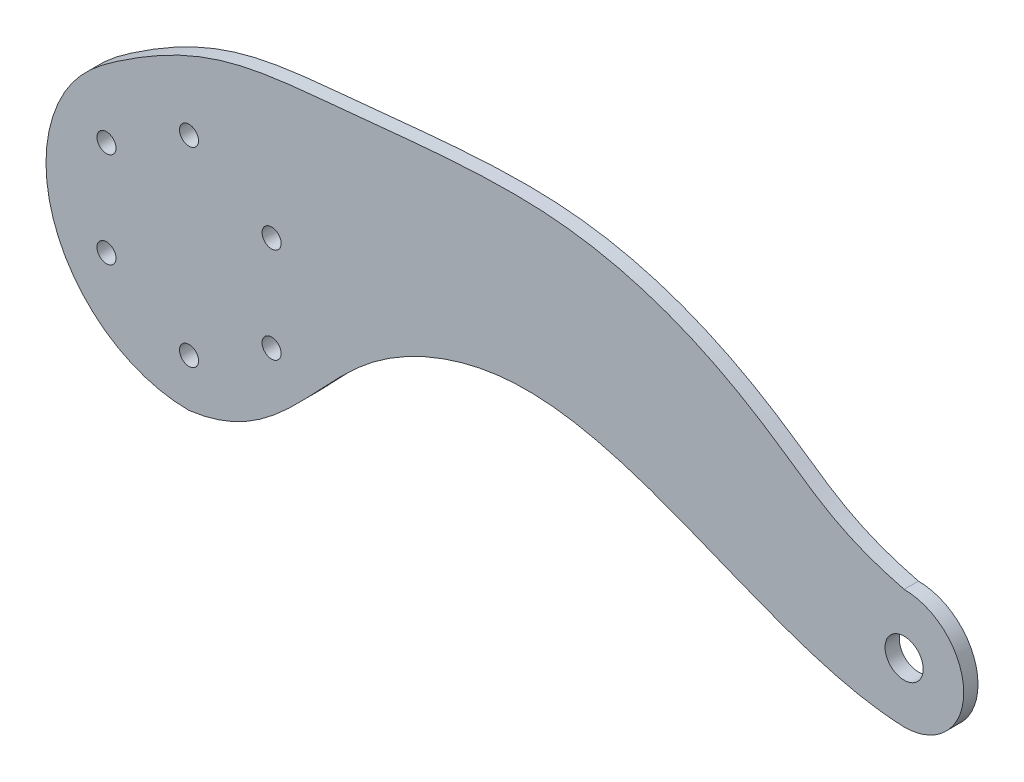
ISO-10303-21;
HEADER;
FILE_DESCRIPTION(('STEP AP214'),'2;1');
FILE_NAME('part.step','',(''),(''),'','','');
FILE_SCHEMA(('AUTOMOTIVE_DESIGN { 1 0 10303 214 1 1 1 1 }'));
ENDSEC;
DATA;
#1=APPLICATION_CONTEXT('core data for automotive mechanical design processes');
#2=APPLICATION_PROTOCOL_DEFINITION('international standard','automotive_design',2000,#1);
#3=PRODUCT_CONTEXT('',#1,'mechanical');
#4=PRODUCT('Part','Part','',(#3));
#5=PRODUCT_RELATED_PRODUCT_CATEGORY('part','',(#4));
#6=PRODUCT_DEFINITION_FORMATION('','',#4);
#7=PRODUCT_DEFINITION_CONTEXT('part definition',#1,'design');
#8=PRODUCT_DEFINITION('design','',#6,#7);
#9=PRODUCT_DEFINITION_SHAPE('','',#8);
#10=(LENGTH_UNIT() NAMED_UNIT(*) SI_UNIT(.MILLI.,.METRE.));
#11=(NAMED_UNIT(*) PLANE_ANGLE_UNIT() SI_UNIT($,.RADIAN.));
#12=(NAMED_UNIT(*) SI_UNIT($,.STERADIAN.) SOLID_ANGLE_UNIT());
#13=UNCERTAINTY_MEASURE_WITH_UNIT(LENGTH_MEASURE(1.E-05),#10,'distance_accuracy_value','');
#14=(GEOMETRIC_REPRESENTATION_CONTEXT(3) GLOBAL_UNCERTAINTY_ASSIGNED_CONTEXT((#13)) GLOBAL_UNIT_ASSIGNED_CONTEXT((#10,
#11,#12)) REPRESENTATION_CONTEXT('',''));
#15=CARTESIAN_POINT('',(0.,0.,0.));
#16=DIRECTION('',(0.,0.,1.));
#17=DIRECTION('',(1.,0.,0.));
#18=AXIS2_PLACEMENT_3D('',#15,#16,#17);
#19=CARTESIAN_POINT('',(150.,0.,3.));
#20=DIRECTION('',(0.,0.,-1.));
#21=DIRECTION('',(-1.,0.,0.));
#22=AXIS2_PLACEMENT_3D('',#19,#20,#21);
#23=CYLINDRICAL_SURFACE('',#22,12.5);
#24=CARTESIAN_POINT('',(150.,0.,0.));
#25=DIRECTION('',(0.,0.,1.));
#26=DIRECTION('',(1.,0.,0.));
#27=AXIS2_PLACEMENT_3D('',#24,#25,#26);
#28=CIRCLE('',#27,12.5);
#29=CARTESIAN_POINT('',(159.428456141883,-8.2069613609783,0.));
#30=VERTEX_POINT('',#29);
#31=CARTESIAN_POINT('',(150.,12.5,0.));
#32=VERTEX_POINT('',#31);
#33=EDGE_CURVE('E174',#30,#32,#28,.T.);
#34=ORIENTED_EDGE('',*,*,#33,.T.);
#35=DIRECTION('',(0.,0.,-1.));
#36=VECTOR('',#35,1.);
#37=CARTESIAN_POINT('',(150.,12.5,3.));
#38=LINE('',#37,#36);
#39=CARTESIAN_POINT('',(150.,12.5,3.));
#40=VERTEX_POINT('',#39);
#41=EDGE_CURVE('E11',#40,#32,#38,.T.);
#42=ORIENTED_EDGE('',*,*,#41,.F.);
#43=CARTESIAN_POINT('',(150.,0.,3.));
#44=DIRECTION('',(0.,0.,1.));
#45=DIRECTION('',(1.,0.,0.));
#46=AXIS2_PLACEMENT_3D('',#43,#44,#45);
#47=CIRCLE('',#46,12.5);
#48=CARTESIAN_POINT('',(159.428456141883,-8.2069613609783,3.));
#49=VERTEX_POINT('',#48);
#50=EDGE_CURVE('E91',#49,#40,#47,.T.);
#51=ORIENTED_EDGE('',*,*,#50,.F.);
#52=DIRECTION('',(0.,0.,-1.));
#53=VECTOR('',#52,1.);
#54=CARTESIAN_POINT('',(159.428456141883,-8.2069613609783,3.));
#55=LINE('',#54,#53);
#56=EDGE_CURVE('E155',#49,#30,#55,.T.);
#57=ORIENTED_EDGE('',*,*,#56,.T.);
#58=EDGE_LOOP('',(#34,#42,#51,#57));
#59=FACE_BOUND('',#58,.T.);
#60=ADVANCED_FACE('F40',(#59),#23,.T.);
#61=CARTESIAN_POINT('',(-26.0634616612886,14.8558394656963,3.));
#62=CARTESIAN_POINT('',(-22.9952074946197,20.2388624193786,3.));
#63=CARTESIAN_POINT('',(2.37328640151583,39.108047074936,3.));
#64=CARTESIAN_POINT('',(20.1597515349127,39.1077374338959,3.));
#65=CARTESIAN_POINT('',(86.7416157626449,46.9998153067509,3.));
#66=CARTESIAN_POINT('',(125.812924925436,25.830072721874,3.));
#67=CARTESIAN_POINT('',(135.882657692138,16.0754827587227,3.));
#68=CARTESIAN_POINT('',(150.,12.5,3.));
#69=B_SPLINE_CURVE_WITH_KNOTS('',3,(#61,#62,#63,#64,#65,#66,#67,#68),.UNSPECIFIED.,.F.,.F.,(4,1,
1,1,1,4),(0.,0.056043778506057,0.324796612619319,0.474987683898155,0.725167046493458,
0.945335070860267),.UNSPECIFIED.);
#70=DIRECTION('',(0.,0.,-1.));
#71=VECTOR('',#70,1.);
#72=SURFACE_OF_LINEAR_EXTRUSION('',#69,#71);
#73=CARTESIAN_POINT('',(-26.0634616612886,14.8558394656963,0.));
#74=CARTESIAN_POINT('',(-22.9952074946197,20.2388624193786,0.));
#75=CARTESIAN_POINT('',(2.37328640151583,39.108047074936,0.));
#76=CARTESIAN_POINT('',(20.1597515349127,39.1077374338959,0.));
#77=CARTESIAN_POINT('',(86.7416157626449,46.9998153067509,0.));
#78=CARTESIAN_POINT('',(125.812924925436,25.830072721874,0.));
#79=CARTESIAN_POINT('',(135.882657692138,16.0754827587227,0.));
#80=CARTESIAN_POINT('',(150.,12.5,0.));
#81=B_SPLINE_CURVE_WITH_KNOTS('',3,(#73,#74,#75,#76,#77,#78,#79,#80),.UNSPECIFIED.,.F.,.F.,(4,1,
1,1,1,4),(0.,0.056043778506057,0.324796612619319,0.474987683898155,0.725167046493458,
0.945335070860267),.UNSPECIFIED.);
#82=CARTESIAN_POINT('',(-26.0634616612886,14.8558394656963,0.));
#83=VERTEX_POINT('',#82);
#84=EDGE_CURVE('E170',#83,#32,#81,.T.);
#85=ORIENTED_EDGE('',*,*,#84,.F.);
#86=DIRECTION('',(0.,0.,-1.));
#87=VECTOR('',#86,1.);
#88=CARTESIAN_POINT('',(-26.0634616612886,14.8558394656963,3.));
#89=LINE('',#88,#87);
#90=CARTESIAN_POINT('',(-26.0634616612886,14.8558394656963,3.));
#91=VERTEX_POINT('',#90);
#92=EDGE_CURVE('E49',#91,#83,#89,.T.);
#93=ORIENTED_EDGE('',*,*,#92,.F.);
#94=EDGE_CURVE('E125',#91,#40,#69,.T.);
#95=ORIENTED_EDGE('',*,*,#94,.T.);
#96=ORIENTED_EDGE('',*,*,#41,.T.);
#97=EDGE_LOOP('',(#85,#93,#95,#96));
#98=FACE_BOUND('',#97,.T.);
#99=ADVANCED_FACE('F172',(#98),#72,.T.);
#100=CARTESIAN_POINT('',(0.,0.,3.));
#101=DIRECTION('',(0.,0.,-1.));
#102=DIRECTION('',(-1.,0.,0.));
#103=AXIS2_PLACEMENT_3D('',#100,#101,#102);
#104=CYLINDRICAL_SURFACE('',#103,30.);
#105=CARTESIAN_POINT('',(0.,0.,0.));
#106=DIRECTION('',(0.,0.,1.));
#107=DIRECTION('',(1.,0.,0.));
#108=AXIS2_PLACEMENT_3D('',#105,#106,#107);
#109=CIRCLE('',#108,30.);
#110=CARTESIAN_POINT('',(0.,-30.,0.));
#111=VERTEX_POINT('',#110);
#112=EDGE_CURVE('E162',#83,#111,#109,.T.);
#113=ORIENTED_EDGE('',*,*,#112,.T.);
#114=DIRECTION('',(0.,0.,-1.));
#115=VECTOR('',#114,1.);
#116=CARTESIAN_POINT('',(0.,-30.,3.));
#117=LINE('',#116,#115);
#118=CARTESIAN_POINT('',(0.,-30.,3.));
#119=VERTEX_POINT('',#118);
#120=EDGE_CURVE('E116',#119,#111,#117,.T.);
#121=ORIENTED_EDGE('',*,*,#120,.F.);
#122=CARTESIAN_POINT('',(0.,0.,3.));
#123=DIRECTION('',(0.,0.,1.));
#124=DIRECTION('',(1.,0.,0.));
#125=AXIS2_PLACEMENT_3D('',#122,#123,#124);
#126=CIRCLE('',#125,30.);
#127=EDGE_CURVE('E107',#91,#119,#126,.T.);
#128=ORIENTED_EDGE('',*,*,#127,.F.);
#129=ORIENTED_EDGE('',*,*,#92,.T.);
#130=EDGE_LOOP('',(#113,#121,#128,#129));
#131=FACE_BOUND('',#130,.T.);
#132=ADVANCED_FACE('F161',(#131),#104,.T.);
#133=CARTESIAN_POINT('',(0.,-30.,3.));
#134=CARTESIAN_POINT('',(17.9367533899456,-27.7458951634713,3.));
#135=CARTESIAN_POINT('',(30.1701670762407,-2.35203179127826,3.));
#136=CARTESIAN_POINT('',(85.2158700652859,19.6119948147056,3.));
#137=CARTESIAN_POINT('',(122.199362380188,-11.5342342503251,3.));
#138=CARTESIAN_POINT('',(150.,-12.5,3.));
#139=B_SPLINE_CURVE_WITH_KNOTS('',3,(#133,#134,#135,#136,#137,#138),.UNSPECIFIED.,.F.,.F.,(4,1,
1,4),(0.,0.288188907900472,0.475939829148129,1.),.UNSPECIFIED.);
#140=DIRECTION('',(0.,0.,-1.));
#141=VECTOR('',#140,1.);
#142=SURFACE_OF_LINEAR_EXTRUSION('',#139,#141);
#143=CARTESIAN_POINT('',(0.,-30.,0.));
#144=CARTESIAN_POINT('',(17.9367533899456,-27.7458951634713,0.));
#145=CARTESIAN_POINT('',(30.1701670762407,-2.35203179127826,0.));
#146=CARTESIAN_POINT('',(85.2158700652859,19.6119948147056,0.));
#147=CARTESIAN_POINT('',(122.199362380188,-11.5342342503251,0.));
#148=CARTESIAN_POINT('',(150.,-12.5,0.));
#149=B_SPLINE_CURVE_WITH_KNOTS('',3,(#143,#144,#145,#146,#147,#148),.UNSPECIFIED.,.F.,.F.,(4,1,
1,4),(0.,0.288188907900472,0.475939829148129,1.),.UNSPECIFIED.);
#150=CARTESIAN_POINT('',(150.,-12.5,0.));
#151=VERTEX_POINT('',#150);
#152=EDGE_CURVE('E115',#111,#151,#149,.T.);
#153=ORIENTED_EDGE('',*,*,#152,.T.);
#154=DIRECTION('',(0.,0.,-1.));
#155=VECTOR('',#154,1.);
#156=CARTESIAN_POINT('',(150.,-12.5,3.));
#157=LINE('',#156,#155);
#158=CARTESIAN_POINT('',(150.,-12.5,3.));
#159=VERTEX_POINT('',#158);
#160=EDGE_CURVE('E112',#159,#151,#157,.T.);
#161=ORIENTED_EDGE('',*,*,#160,.F.);
#162=EDGE_CURVE('E100',#119,#159,#139,.T.);
#163=ORIENTED_EDGE('',*,*,#162,.F.);
#164=ORIENTED_EDGE('',*,*,#120,.T.);
#165=EDGE_LOOP('',(#153,#161,#163,#164));
#166=FACE_BOUND('',#165,.T.);
#167=ADVANCED_FACE('F113',(#166),#142,.F.);
#168=CARTESIAN_POINT('',(157.604608426971,-9.92068196609678,0.));
#169=VERTEX_POINT('',#168);
#170=EDGE_CURVE('E79',#151,#169,#28,.T.);
#171=ORIENTED_EDGE('',*,*,#170,.T.);
#172=DIRECTION('',(0.,0.,-1.));
#173=VECTOR('',#172,1.);
#174=CARTESIAN_POINT('',(157.604608426971,-9.92068196609678,3.));
#175=LINE('',#174,#173);
#176=CARTESIAN_POINT('',(157.604608426971,-9.92068196609678,3.));
#177=VERTEX_POINT('',#176);
#178=EDGE_CURVE('E117',#177,#169,#175,.T.);
#179=ORIENTED_EDGE('',*,*,#178,.F.);
#180=EDGE_CURVE('E105',#159,#177,#47,.T.);
#181=ORIENTED_EDGE('',*,*,#180,.F.);
#182=ORIENTED_EDGE('',*,*,#160,.T.);
#183=EDGE_LOOP('',(#171,#179,#181,#182));
#184=FACE_BOUND('',#183,.T.);
#185=ADVANCED_FACE('F119',(#184),#23,.T.);
#186=CARTESIAN_POINT('',(-17.3205080756875,-10.0000000000007,3.));
#187=DIRECTION('',(0.,0.,-1.));
#188=DIRECTION('',(-1.,0.,0.));
#189=AXIS2_PLACEMENT_3D('',#186,#187,#188);
#190=CYLINDRICAL_SURFACE('',#189,2.);
#191=CARTESIAN_POINT('',(-17.3205080756875,-10.0000000000007,3.));
#192=DIRECTION('',(0.,0.,1.));
#193=DIRECTION('',(1.,0.,0.));
#194=AXIS2_PLACEMENT_3D('',#191,#192,#193);
#195=CIRCLE('',#194,2.);
#196=CARTESIAN_POINT('',(-15.3205080756875,-10.0000000000007,3.));
#197=VERTEX_POINT('',#196);
#198=EDGE_CURVE('E121',#197,#197,#195,.T.);
#199=ORIENTED_EDGE('',*,*,#198,.T.);
#200=EDGE_LOOP('',(#199));
#201=FACE_BOUND('',#200,.T.);
#202=CARTESIAN_POINT('',(-17.3205080756875,-10.0000000000007,0.));
#203=DIRECTION('',(0.,0.,1.));
#204=DIRECTION('',(1.,0.,0.));
#205=AXIS2_PLACEMENT_3D('',#202,#203,#204);
#206=CIRCLE('',#205,2.);
#207=CARTESIAN_POINT('',(-15.3205080756875,-10.0000000000007,0.));
#208=VERTEX_POINT('',#207);
#209=EDGE_CURVE('E147',#208,#208,#206,.T.);
#210=ORIENTED_EDGE('',*,*,#209,.F.);
#211=EDGE_LOOP('',(#210));
#212=FACE_BOUND('',#211,.T.);
#213=ADVANCED_FACE('F228',(#201,#212),#190,.F.);
#214=CARTESIAN_POINT('',(150.,-12.5,3.));
#215=CARTESIAN_POINT('',(154.881138688973,-13.047211763152,3.));
#216=CARTESIAN_POINT('',(159.428456141883,-8.20696136097829,3.));
#217=B_SPLINE_CURVE_WITH_KNOTS('',2,(#214,#215,#216),.UNSPECIFIED.,.F.,.F.,(3,3),
(0.955766329423218,1.),.UNSPECIFIED.);
#218=DIRECTION('',(0.,0.,-1.));
#219=VECTOR('',#218,1.);
#220=SURFACE_OF_LINEAR_EXTRUSION('',#217,#219);
#221=CARTESIAN_POINT('',(150.,-12.5,0.));
#222=CARTESIAN_POINT('',(154.881138688973,-13.047211763152,0.));
#223=CARTESIAN_POINT('',(159.428456141883,-8.20696136097829,0.));
#224=B_SPLINE_CURVE_WITH_KNOTS('',2,(#221,#222,#223),.UNSPECIFIED.,.F.,.F.,(3,3),
(0.955766329423218,1.),.UNSPECIFIED.);
#225=EDGE_CURVE('E85',#169,#30,#224,.T.);
#226=ORIENTED_EDGE('',*,*,#225,.T.);
#227=ORIENTED_EDGE('',*,*,#56,.F.);
#228=EDGE_CURVE('E57',#177,#49,#217,.T.);
#229=ORIENTED_EDGE('',*,*,#228,.F.);
#230=ORIENTED_EDGE('',*,*,#178,.T.);
#231=EDGE_LOOP('',(#226,#227,#229,#230));
#232=FACE_BOUND('',#231,.T.);
#233=ADVANCED_FACE('F223',(#232),#220,.F.);
#234=CARTESIAN_POINT('',(1.68815751063618E-12,-20.,3.));
#235=DIRECTION('',(0.,0.,-1.));
#236=DIRECTION('',(-1.,0.,0.));
#237=AXIS2_PLACEMENT_3D('',#234,#235,#236);
#238=CYLINDRICAL_SURFACE('',#237,2.);
#239=CARTESIAN_POINT('',(1.68815751063618E-12,-20.,3.));
#240=DIRECTION('',(0.,0.,1.));
#241=DIRECTION('',(1.,0.,0.));
#242=AXIS2_PLACEMENT_3D('',#239,#240,#241);
#243=CIRCLE('',#242,2.);
#244=CARTESIAN_POINT('',(2.00000000000169,-20.,3.));
#245=VERTEX_POINT('',#244);
#246=EDGE_CURVE('E126',#245,#245,#243,.T.);
#247=ORIENTED_EDGE('',*,*,#246,.T.);
#248=EDGE_LOOP('',(#247));
#249=FACE_BOUND('',#248,.T.);
#250=CARTESIAN_POINT('',(1.68815751063618E-12,-20.,0.));
#251=DIRECTION('',(0.,0.,1.));
#252=DIRECTION('',(1.,0.,0.));
#253=AXIS2_PLACEMENT_3D('',#250,#251,#252);
#254=CIRCLE('',#253,2.);
#255=CARTESIAN_POINT('',(2.00000000000169,-20.,0.));
#256=VERTEX_POINT('',#255);
#257=EDGE_CURVE('E176',#256,#256,#254,.T.);
#258=ORIENTED_EDGE('',*,*,#257,.F.);
#259=EDGE_LOOP('',(#258));
#260=FACE_BOUND('',#259,.T.);
#261=ADVANCED_FACE('F227',(#249,#260),#238,.F.);
#262=CARTESIAN_POINT('',(17.32050807569,-9.99999999999927,3.));
#263=DIRECTION('',(0.,0.,-1.));
#264=DIRECTION('',(-1.,0.,0.));
#265=AXIS2_PLACEMENT_3D('',#262,#263,#264);
#266=CYLINDRICAL_SURFACE('',#265,2.);
#267=CARTESIAN_POINT('',(17.32050807569,-9.99999999999927,3.));
#268=DIRECTION('',(0.,0.,1.));
#269=DIRECTION('',(1.,0.,0.));
#270=AXIS2_PLACEMENT_3D('',#267,#268,#269);
#271=CIRCLE('',#270,2.);
#272=CARTESIAN_POINT('',(19.32050807569,-9.99999999999927,3.));
#273=VERTEX_POINT('',#272);
#274=EDGE_CURVE('E129',#273,#273,#271,.T.);
#275=ORIENTED_EDGE('',*,*,#274,.T.);
#276=EDGE_LOOP('',(#275));
#277=FACE_BOUND('',#276,.T.);
#278=CARTESIAN_POINT('',(17.32050807569,-9.99999999999927,0.));
#279=DIRECTION('',(0.,0.,1.));
#280=DIRECTION('',(1.,0.,0.));
#281=AXIS2_PLACEMENT_3D('',#278,#279,#280);
#282=CIRCLE('',#281,2.);
#283=CARTESIAN_POINT('',(19.32050807569,-9.99999999999927,0.));
#284=VERTEX_POINT('',#283);
#285=EDGE_CURVE('E197',#284,#284,#282,.T.);
#286=ORIENTED_EDGE('',*,*,#285,.F.);
#287=EDGE_LOOP('',(#286));
#288=FACE_BOUND('',#287,.T.);
#289=ADVANCED_FACE('F246',(#277,#288),#266,.F.);
#290=CARTESIAN_POINT('',(17.3205080756892,10.0000000000007,3.));
#291=DIRECTION('',(0.,0.,-1.));
#292=DIRECTION('',(-1.,0.,0.));
#293=AXIS2_PLACEMENT_3D('',#290,#291,#292);
#294=CYLINDRICAL_SURFACE('',#293,2.00000000000001);
#295=CARTESIAN_POINT('',(17.3205080756892,10.0000000000007,3.));
#296=DIRECTION('',(0.,0.,1.));
#297=DIRECTION('',(1.,0.,0.));
#298=AXIS2_PLACEMENT_3D('',#295,#296,#297);
#299=CIRCLE('',#298,2.00000000000001);
#300=CARTESIAN_POINT('',(19.3205080756892,10.0000000000007,3.));
#301=VERTEX_POINT('',#300);
#302=EDGE_CURVE('E133',#301,#301,#299,.T.);
#303=ORIENTED_EDGE('',*,*,#302,.T.);
#304=EDGE_LOOP('',(#303));
#305=FACE_BOUND('',#304,.T.);
#306=CARTESIAN_POINT('',(17.3205080756892,10.0000000000007,0.));
#307=DIRECTION('',(0.,0.,1.));
#308=DIRECTION('',(1.,0.,0.));
#309=AXIS2_PLACEMENT_3D('',#306,#307,#308);
#310=CIRCLE('',#309,2.00000000000001);
#311=CARTESIAN_POINT('',(19.3205080756892,10.0000000000007,0.));
#312=VERTEX_POINT('',#311);
#313=EDGE_CURVE('E200',#312,#312,#310,.T.);
#314=ORIENTED_EDGE('',*,*,#313,.F.);
#315=EDGE_LOOP('',(#314));
#316=FACE_BOUND('',#315,.T.);
#317=ADVANCED_FACE('F249',(#305,#316),#294,.F.);
#318=CARTESIAN_POINT('',(0.,20.,3.));
#319=DIRECTION('',(0.,0.,-1.));
#320=DIRECTION('',(-1.,0.,0.));
#321=AXIS2_PLACEMENT_3D('',#318,#319,#320);
#322=CYLINDRICAL_SURFACE('',#321,2.);
#323=CARTESIAN_POINT('',(0.,20.,3.));
#324=DIRECTION('',(0.,0.,1.));
#325=DIRECTION('',(1.,0.,0.));
#326=AXIS2_PLACEMENT_3D('',#323,#324,#325);
#327=CIRCLE('',#326,2.);
#328=CARTESIAN_POINT('',(2.,20.,3.));
#329=VERTEX_POINT('',#328);
#330=EDGE_CURVE('E138',#329,#329,#327,.T.);
#331=ORIENTED_EDGE('',*,*,#330,.T.);
#332=EDGE_LOOP('',(#331));
#333=FACE_BOUND('',#332,.T.);
#334=CARTESIAN_POINT('',(0.,20.,0.));
#335=DIRECTION('',(0.,0.,1.));
#336=DIRECTION('',(1.,0.,0.));
#337=AXIS2_PLACEMENT_3D('',#334,#335,#336);
#338=CIRCLE('',#337,2.);
#339=CARTESIAN_POINT('',(2.,20.,0.));
#340=VERTEX_POINT('',#339);
#341=EDGE_CURVE('E203',#340,#340,#338,.T.);
#342=ORIENTED_EDGE('',*,*,#341,.F.);
#343=EDGE_LOOP('',(#342));
#344=FACE_BOUND('',#343,.T.);
#345=ADVANCED_FACE('F252',(#333,#344),#322,.F.);
#346=CARTESIAN_POINT('',(-17.3205080756884,9.99999999999926,3.));
#347=DIRECTION('',(0.,0.,-1.));
#348=DIRECTION('',(-1.,0.,0.));
#349=AXIS2_PLACEMENT_3D('',#346,#347,#348);
#350=CYLINDRICAL_SURFACE('',#349,2.);
#351=CARTESIAN_POINT('',(-17.3205080756884,9.99999999999926,3.));
#352=DIRECTION('',(0.,0.,1.));
#353=DIRECTION('',(1.,0.,0.));
#354=AXIS2_PLACEMENT_3D('',#351,#352,#353);
#355=CIRCLE('',#354,2.);
#356=CARTESIAN_POINT('',(-15.3205080756884,9.99999999999926,3.));
#357=VERTEX_POINT('',#356);
#358=EDGE_CURVE('E141',#357,#357,#355,.T.);
#359=ORIENTED_EDGE('',*,*,#358,.T.);
#360=EDGE_LOOP('',(#359));
#361=FACE_BOUND('',#360,.T.);
#362=CARTESIAN_POINT('',(-17.3205080756884,9.99999999999926,0.));
#363=DIRECTION('',(0.,0.,1.));
#364=DIRECTION('',(1.,0.,0.));
#365=AXIS2_PLACEMENT_3D('',#362,#363,#364);
#366=CIRCLE('',#365,2.);
#367=CARTESIAN_POINT('',(-15.3205080756884,9.99999999999926,0.));
#368=VERTEX_POINT('',#367);
#369=EDGE_CURVE('E206',#368,#368,#366,.T.);
#370=ORIENTED_EDGE('',*,*,#369,.F.);
#371=EDGE_LOOP('',(#370));
#372=FACE_BOUND('',#371,.T.);
#373=ADVANCED_FACE('F42',(#361,#372),#350,.F.);
#374=CARTESIAN_POINT('',(150.,0.,3.));
#375=DIRECTION('',(0.,0.,-1.));
#376=DIRECTION('',(-1.,0.,0.));
#377=AXIS2_PLACEMENT_3D('',#374,#375,#376);
#378=CYLINDRICAL_SURFACE('',#377,3.99999999999999);
#379=CARTESIAN_POINT('',(150.,0.,3.));
#380=DIRECTION('',(0.,0.,1.));
#381=DIRECTION('',(1.,0.,0.));
#382=AXIS2_PLACEMENT_3D('',#379,#380,#381);
#383=CIRCLE('',#382,3.99999999999999);
#384=CARTESIAN_POINT('',(154.,0.,3.));
#385=VERTEX_POINT('',#384);
#386=EDGE_CURVE('E157',#385,#385,#383,.T.);
#387=ORIENTED_EDGE('',*,*,#386,.T.);
#388=EDGE_LOOP('',(#387));
#389=FACE_BOUND('',#388,.T.);
#390=CARTESIAN_POINT('',(150.,0.,0.));
#391=DIRECTION('',(0.,0.,1.));
#392=DIRECTION('',(1.,0.,0.));
#393=AXIS2_PLACEMENT_3D('',#390,#391,#392);
#394=CIRCLE('',#393,3.99999999999999);
#395=CARTESIAN_POINT('',(154.,0.,0.));
#396=VERTEX_POINT('',#395);
#397=EDGE_CURVE('E143',#396,#396,#394,.T.);
#398=ORIENTED_EDGE('',*,*,#397,.F.);
#399=EDGE_LOOP('',(#398));
#400=FACE_BOUND('',#399,.T.);
#401=ADVANCED_FACE('F259',(#389,#400),#378,.F.);
#402=CARTESIAN_POINT('',(0.,0.,3.));
#403=DIRECTION('',(0.,0.,1.));
#404=DIRECTION('',(1.,0.,0.));
#405=AXIS2_PLACEMENT_3D('',#402,#403,#404);
#406=PLANE('',#405);
#407=ORIENTED_EDGE('',*,*,#358,.F.);
#408=EDGE_LOOP('',(#407));
#409=FACE_BOUND('',#408,.T.);
#410=ORIENTED_EDGE('',*,*,#330,.F.);
#411=EDGE_LOOP('',(#410));
#412=FACE_BOUND('',#411,.T.);
#413=ORIENTED_EDGE('',*,*,#302,.F.);
#414=EDGE_LOOP('',(#413));
#415=FACE_BOUND('',#414,.T.);
#416=ORIENTED_EDGE('',*,*,#274,.F.);
#417=EDGE_LOOP('',(#416));
#418=FACE_BOUND('',#417,.T.);
#419=ORIENTED_EDGE('',*,*,#246,.F.);
#420=EDGE_LOOP('',(#419));
#421=FACE_BOUND('',#420,.T.);
#422=ORIENTED_EDGE('',*,*,#50,.T.);
#423=ORIENTED_EDGE('',*,*,#94,.F.);
#424=ORIENTED_EDGE('',*,*,#127,.T.);
#425=ORIENTED_EDGE('',*,*,#162,.T.);
#426=ORIENTED_EDGE('',*,*,#180,.T.);
#427=ORIENTED_EDGE('',*,*,#228,.T.);
#428=EDGE_LOOP('',(#422,#423,#424,#425,#426,#427));
#429=FACE_BOUND('',#428,.T.);
#430=ORIENTED_EDGE('',*,*,#198,.F.);
#431=EDGE_LOOP('',(#430));
#432=FACE_BOUND('',#431,.T.);
#433=ORIENTED_EDGE('',*,*,#386,.F.);
#434=EDGE_LOOP('',(#433));
#435=FACE_BOUND('',#434,.T.);
#436=ADVANCED_FACE('F102',(#409,#412,#415,#418,#421,#429,#432,#435),#406,.T.);
#437=CARTESIAN_POINT('',(0.,0.,0.));
#438=DIRECTION('',(0.,0.,1.));
#439=DIRECTION('',(1.,0.,0.));
#440=AXIS2_PLACEMENT_3D('',#437,#438,#439);
#441=PLANE('',#440);
#442=ORIENTED_EDGE('',*,*,#369,.T.);
#443=EDGE_LOOP('',(#442));
#444=FACE_BOUND('',#443,.T.);
#445=ORIENTED_EDGE('',*,*,#341,.T.);
#446=EDGE_LOOP('',(#445));
#447=FACE_BOUND('',#446,.T.);
#448=ORIENTED_EDGE('',*,*,#313,.T.);
#449=EDGE_LOOP('',(#448));
#450=FACE_BOUND('',#449,.T.);
#451=ORIENTED_EDGE('',*,*,#285,.T.);
#452=EDGE_LOOP('',(#451));
#453=FACE_BOUND('',#452,.T.);
#454=ORIENTED_EDGE('',*,*,#257,.T.);
#455=EDGE_LOOP('',(#454));
#456=FACE_BOUND('',#455,.T.);
#457=ORIENTED_EDGE('',*,*,#33,.F.);
#458=ORIENTED_EDGE('',*,*,#225,.F.);
#459=ORIENTED_EDGE('',*,*,#170,.F.);
#460=ORIENTED_EDGE('',*,*,#152,.F.);
#461=ORIENTED_EDGE('',*,*,#112,.F.);
#462=ORIENTED_EDGE('',*,*,#84,.T.);
#463=EDGE_LOOP('',(#457,#458,#459,#460,#461,#462));
#464=FACE_BOUND('',#463,.T.);
#465=ORIENTED_EDGE('',*,*,#209,.T.);
#466=EDGE_LOOP('',(#465));
#467=FACE_BOUND('',#466,.T.);
#468=ORIENTED_EDGE('',*,*,#397,.T.);
#469=EDGE_LOOP('',(#468));
#470=FACE_BOUND('',#469,.T.);
#471=ADVANCED_FACE('F168',(#444,#447,#450,#453,#456,#464,#467,#470),#441,.F.);
#472=CLOSED_SHELL('',(#60,#99,#132,#167,#185,#213,#233,#261,#289,#317,#345,#373,#401,#436,#471));
#473=MANIFOLD_SOLID_BREP('B2',#472);
#474=ADVANCED_BREP_SHAPE_REPRESENTATION('',(#18,#473),#14);
#475=SHAPE_DEFINITION_REPRESENTATION(#9,#474);
ENDSEC;
END-ISO-10303-21;
